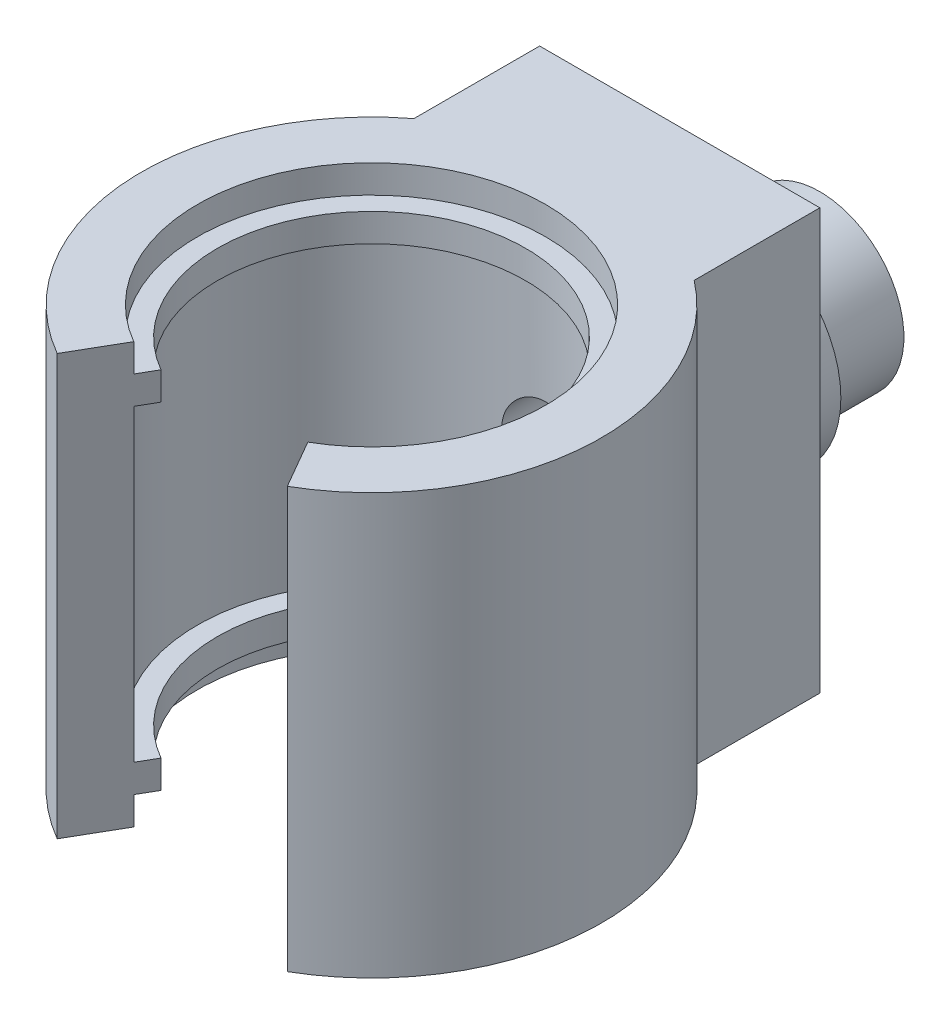
ISO-10303-21;
HEADER;
FILE_DESCRIPTION(('STEP AP214'),'2;1');
FILE_NAME('part.step','',(''),(''),'','','');
FILE_SCHEMA(('AUTOMOTIVE_DESIGN { 1 0 10303 214 1 1 1 1 }'));
ENDSEC;
DATA;
#1=APPLICATION_CONTEXT('core data for automotive mechanical design processes');
#2=APPLICATION_PROTOCOL_DEFINITION('international standard','automotive_design',2000,#1);
#3=PRODUCT_CONTEXT('',#1,'mechanical');
#4=PRODUCT('Part','Part','',(#3));
#5=PRODUCT_RELATED_PRODUCT_CATEGORY('part','',(#4));
#6=PRODUCT_DEFINITION_FORMATION('','',#4);
#7=PRODUCT_DEFINITION_CONTEXT('part definition',#1,'design');
#8=PRODUCT_DEFINITION('design','',#6,#7);
#9=PRODUCT_DEFINITION_SHAPE('','',#8);
#10=(LENGTH_UNIT() NAMED_UNIT(*) SI_UNIT(.MILLI.,.METRE.));
#11=(NAMED_UNIT(*) PLANE_ANGLE_UNIT() SI_UNIT($,.RADIAN.));
#12=(NAMED_UNIT(*) SI_UNIT($,.STERADIAN.) SOLID_ANGLE_UNIT());
#13=UNCERTAINTY_MEASURE_WITH_UNIT(LENGTH_MEASURE(1.E-05),#10,'distance_accuracy_value','');
#14=(GEOMETRIC_REPRESENTATION_CONTEXT(3) GLOBAL_UNCERTAINTY_ASSIGNED_CONTEXT((#13)) GLOBAL_UNIT_ASSIGNED_CONTEXT((#10,
#11,#12)) REPRESENTATION_CONTEXT('',''));
#15=CARTESIAN_POINT('',(0.,0.,0.));
#16=DIRECTION('',(0.,0.,1.));
#17=DIRECTION('',(1.,0.,0.));
#18=AXIS2_PLACEMENT_3D('',#15,#16,#17);
#19=CARTESIAN_POINT('',(0.,15.,0.));
#20=DIRECTION('',(0.,-1.,0.));
#21=DIRECTION('',(0.,0.,-1.));
#22=AXIS2_PLACEMENT_3D('',#19,#20,#21);
#23=CYLINDRICAL_SURFACE('',#22,6.21127915577534);
#24=DIRECTION('',(0.,1.,0.));
#25=VECTOR('',#24,1.);
#26=CARTESIAN_POINT('',(-3.10563957788768,0.,5.37912553889821));
#27=LINE('',#26,#25);
#28=CARTESIAN_POINT('',(-3.10563957788768,14.,5.37912553889821));
#29=VERTEX_POINT('',#28);
#30=CARTESIAN_POINT('',(-3.10563957788768,15.,5.37912553889821));
#31=VERTEX_POINT('',#30);
#32=EDGE_CURVE('E55',#29,#31,#27,.T.);
#33=ORIENTED_EDGE('',*,*,#32,.F.);
#34=CARTESIAN_POINT('',(0.,14.,0.));
#35=DIRECTION('',(0.,-1.,0.));
#36=DIRECTION('',(0.,0.,1.));
#37=AXIS2_PLACEMENT_3D('',#34,#35,#36);
#38=CIRCLE('',#37,6.21127915577534);
#39=CARTESIAN_POINT('',(3.10563957788768,14.,5.37912553889821));
#40=VERTEX_POINT('',#39);
#41=EDGE_CURVE('E183',#29,#40,#38,.T.);
#42=ORIENTED_EDGE('',*,*,#41,.T.);
#43=DIRECTION('',(0.,1.,0.));
#44=VECTOR('',#43,1.);
#45=CARTESIAN_POINT('',(3.10563957788768,0.,5.37912553889821));
#46=LINE('',#45,#44);
#47=CARTESIAN_POINT('',(3.10563957788768,15.,5.37912553889821));
#48=VERTEX_POINT('',#47);
#49=EDGE_CURVE('E226',#40,#48,#46,.T.);
#50=ORIENTED_EDGE('',*,*,#49,.T.);
#51=CARTESIAN_POINT('',(0.,15.,0.));
#52=DIRECTION('',(0.,1.,0.));
#53=DIRECTION('',(0.,0.,1.));
#54=AXIS2_PLACEMENT_3D('',#51,#52,#53);
#55=CIRCLE('',#54,6.21127915577534);
#56=EDGE_CURVE('E240',#48,#31,#55,.T.);
#57=ORIENTED_EDGE('',*,*,#56,.T.);
#58=EDGE_LOOP('',(#33,#42,#50,#57));
#59=FACE_BOUND('',#58,.T.);
#60=ADVANCED_FACE('F38',(#59),#23,.F.);
#61=CARTESIAN_POINT('',(3.10563957788768,0.,5.37912553889821));
#62=VERTEX_POINT('',#61);
#63=CARTESIAN_POINT('',(3.10563957788768,1.,5.37912553889821));
#64=VERTEX_POINT('',#63);
#65=EDGE_CURVE('E228',#62,#64,#46,.T.);
#66=ORIENTED_EDGE('',*,*,#65,.T.);
#67=CARTESIAN_POINT('',(0.,1.,0.));
#68=DIRECTION('',(0.,-1.,0.));
#69=DIRECTION('',(0.,0.,1.));
#70=AXIS2_PLACEMENT_3D('',#67,#68,#69);
#71=CIRCLE('',#70,6.21127915577534);
#72=CARTESIAN_POINT('',(-3.10563957788768,1.,5.37912553889821));
#73=VERTEX_POINT('',#72);
#74=EDGE_CURVE('E190',#73,#64,#71,.T.);
#75=ORIENTED_EDGE('',*,*,#74,.F.);
#76=CARTESIAN_POINT('',(-3.10563957788768,0.,5.37912553889821));
#77=VERTEX_POINT('',#76);
#78=EDGE_CURVE('E232',#77,#73,#27,.T.);
#79=ORIENTED_EDGE('',*,*,#78,.F.);
#80=CARTESIAN_POINT('',(0.,0.,0.));
#81=DIRECTION('',(0.,1.,0.));
#82=DIRECTION('',(0.,0.,1.));
#83=AXIS2_PLACEMENT_3D('',#80,#81,#82);
#84=CIRCLE('',#83,6.21127915577534);
#85=EDGE_CURVE('E237',#62,#77,#84,.T.);
#86=ORIENTED_EDGE('',*,*,#85,.F.);
#87=EDGE_LOOP('',(#66,#75,#79,#86));
#88=FACE_BOUND('',#87,.T.);
#89=ADVANCED_FACE('F326',(#88),#23,.F.);
#90=CARTESIAN_POINT('',(0.,15.,0.));
#91=DIRECTION('',(0.,-1.,0.));
#92=DIRECTION('',(0.,0.,-1.));
#93=AXIS2_PLACEMENT_3D('',#90,#91,#92);
#94=CYLINDRICAL_SURFACE('',#93,8.21127915577534);
#95=CARTESIAN_POINT('',(0.,15.,0.));
#96=DIRECTION('',(0.,1.,0.));
#97=DIRECTION('',(0.,0.,1.));
#98=AXIS2_PLACEMENT_3D('',#95,#96,#97);
#99=CIRCLE('',#98,8.21127915577534);
#100=CARTESIAN_POINT('',(4.10563957788768,15.,7.11117634646708));
#101=VERTEX_POINT('',#100);
#102=CARTESIAN_POINT('',(5.,15.,-6.51345571675057));
#103=VERTEX_POINT('',#102);
#104=EDGE_CURVE('E246',#101,#103,#99,.T.);
#105=ORIENTED_EDGE('',*,*,#104,.F.);
#106=DIRECTION('',(0.,1.,0.));
#107=VECTOR('',#106,1.);
#108=CARTESIAN_POINT('',(4.10563957788768,0.,7.11117634646708));
#109=LINE('',#108,#107);
#110=CARTESIAN_POINT('',(4.10563957788768,0.,7.11117634646708));
#111=VERTEX_POINT('',#110);
#112=EDGE_CURVE('E224',#111,#101,#109,.T.);
#113=ORIENTED_EDGE('',*,*,#112,.F.);
#114=CARTESIAN_POINT('',(0.,0.,0.));
#115=DIRECTION('',(0.,1.,0.));
#116=DIRECTION('',(0.,0.,1.));
#117=AXIS2_PLACEMENT_3D('',#114,#115,#116);
#118=CIRCLE('',#117,8.21127915577534);
#119=CARTESIAN_POINT('',(5.,0.,-6.51345571675057));
#120=VERTEX_POINT('',#119);
#121=EDGE_CURVE('E257',#111,#120,#118,.T.);
#122=ORIENTED_EDGE('',*,*,#121,.T.);
#123=DIRECTION('',(0.,-1.,0.));
#124=VECTOR('',#123,1.);
#125=CARTESIAN_POINT('',(5.,15.,-6.51345571675057));
#126=LINE('',#125,#124);
#127=EDGE_CURVE('E271',#103,#120,#126,.T.);
#128=ORIENTED_EDGE('',*,*,#127,.F.);
#129=EDGE_LOOP('',(#105,#113,#122,#128));
#130=FACE_BOUND('',#129,.T.);
#131=ADVANCED_FACE('F331',(#130),#94,.T.);
#132=CARTESIAN_POINT('',(0.,15.,0.));
#133=DIRECTION('',(0.,1.,0.));
#134=DIRECTION('',(0.,0.,1.));
#135=AXIS2_PLACEMENT_3D('',#132,#133,#134);
#136=PLANE('',#135);
#137=DIRECTION('',(-0.500000000000001,0.,-0.866025403784438));
#138=VECTOR('',#137,1.);
#139=CARTESIAN_POINT('',(3.10563957788768,15.,5.37912553889821));
#140=LINE('',#139,#138);
#141=EDGE_CURVE('E241',#101,#48,#140,.T.);
#142=ORIENTED_EDGE('',*,*,#141,.F.);
#143=ORIENTED_EDGE('',*,*,#104,.T.);
#144=DIRECTION('',(0.,0.,-1.));
#145=VECTOR('',#144,1.);
#146=CARTESIAN_POINT('',(5.,15.,-6.51345571675057));
#147=LINE('',#146,#145);
#148=CARTESIAN_POINT('',(5.,15.,-11.));
#149=VERTEX_POINT('',#148);
#150=EDGE_CURVE('E245',#103,#149,#147,.T.);
#151=ORIENTED_EDGE('',*,*,#150,.T.);
#152=DIRECTION('',(-1.,0.,0.));
#153=VECTOR('',#152,1.);
#154=CARTESIAN_POINT('',(-5.,15.,-11.));
#155=LINE('',#154,#153);
#156=CARTESIAN_POINT('',(-5.,15.,-11.));
#157=VERTEX_POINT('',#156);
#158=EDGE_CURVE('E248',#149,#157,#155,.T.);
#159=ORIENTED_EDGE('',*,*,#158,.T.);
#160=DIRECTION('',(0.,0.,1.));
#161=VECTOR('',#160,1.);
#162=CARTESIAN_POINT('',(-5.,15.,-6.51345571675057));
#163=LINE('',#162,#161);
#164=CARTESIAN_POINT('',(-5.,15.,-6.51345571675057));
#165=VERTEX_POINT('',#164);
#166=EDGE_CURVE('E250',#157,#165,#163,.T.);
#167=ORIENTED_EDGE('',*,*,#166,.T.);
#168=CARTESIAN_POINT('',(-4.10563957788768,15.,7.11117634646708));
#169=VERTEX_POINT('',#168);
#170=EDGE_CURVE('E242',#165,#169,#99,.T.);
#171=ORIENTED_EDGE('',*,*,#170,.T.);
#172=DIRECTION('',(-0.500000000000001,0.,0.866025403784438));
#173=VECTOR('',#172,1.);
#174=CARTESIAN_POINT('',(-3.10563957788768,15.,5.37912553889821));
#175=LINE('',#174,#173);
#176=EDGE_CURVE('E230',#31,#169,#175,.T.);
#177=ORIENTED_EDGE('',*,*,#176,.F.);
#178=ORIENTED_EDGE('',*,*,#56,.F.);
#179=EDGE_LOOP('',(#142,#143,#151,#159,#167,#171,#177,#178));
#180=FACE_BOUND('',#179,.T.);
#181=ADVANCED_FACE('F336',(#180),#136,.T.);
#182=CARTESIAN_POINT('',(0.,0.,0.));
#183=DIRECTION('',(0.,1.,0.));
#184=DIRECTION('',(0.,0.,1.));
#185=AXIS2_PLACEMENT_3D('',#182,#183,#184);
#186=PLANE('',#185);
#187=ORIENTED_EDGE('',*,*,#121,.F.);
#188=DIRECTION('',(-0.500000000000001,0.,-0.866025403784438));
#189=VECTOR('',#188,1.);
#190=CARTESIAN_POINT('',(3.10563957788768,0.,5.37912553889821));
#191=LINE('',#190,#189);
#192=EDGE_CURVE('E221',#111,#62,#191,.T.);
#193=ORIENTED_EDGE('',*,*,#192,.T.);
#194=ORIENTED_EDGE('',*,*,#85,.T.);
#195=DIRECTION('',(-0.500000000000001,0.,0.866025403784438));
#196=VECTOR('',#195,1.);
#197=CARTESIAN_POINT('',(-3.10563957788768,0.,5.37912553889821));
#198=LINE('',#197,#196);
#199=CARTESIAN_POINT('',(-4.10563957788768,0.,7.11117634646708));
#200=VERTEX_POINT('',#199);
#201=EDGE_CURVE('E217',#77,#200,#198,.T.);
#202=ORIENTED_EDGE('',*,*,#201,.T.);
#203=CARTESIAN_POINT('',(-5.,0.,-6.51345571675057));
#204=VERTEX_POINT('',#203);
#205=EDGE_CURVE('E253',#204,#200,#118,.T.);
#206=ORIENTED_EDGE('',*,*,#205,.F.);
#207=DIRECTION('',(0.,0.,1.));
#208=VECTOR('',#207,1.);
#209=CARTESIAN_POINT('',(-5.,0.,-6.51345571675057));
#210=LINE('',#209,#208);
#211=CARTESIAN_POINT('',(-5.,0.,-11.));
#212=VERTEX_POINT('',#211);
#213=EDGE_CURVE('E261',#212,#204,#210,.T.);
#214=ORIENTED_EDGE('',*,*,#213,.F.);
#215=DIRECTION('',(-1.,0.,0.));
#216=VECTOR('',#215,1.);
#217=CARTESIAN_POINT('',(-5.,0.,-11.));
#218=LINE('',#217,#216);
#219=CARTESIAN_POINT('',(5.,0.,-11.));
#220=VERTEX_POINT('',#219);
#221=EDGE_CURVE('E259',#220,#212,#218,.T.);
#222=ORIENTED_EDGE('',*,*,#221,.F.);
#223=DIRECTION('',(0.,0.,-1.));
#224=VECTOR('',#223,1.);
#225=CARTESIAN_POINT('',(5.,0.,-6.51345571675057));
#226=LINE('',#225,#224);
#227=EDGE_CURVE('E256',#120,#220,#226,.T.);
#228=ORIENTED_EDGE('',*,*,#227,.F.);
#229=EDGE_LOOP('',(#187,#193,#194,#202,#206,#214,#222,#228));
#230=FACE_BOUND('',#229,.T.);
#231=ADVANCED_FACE('F345',(#230),#186,.F.);
#232=ORIENTED_EDGE('',*,*,#205,.T.);
#233=DIRECTION('',(0.,1.,0.));
#234=VECTOR('',#233,1.);
#235=CARTESIAN_POINT('',(-4.10563957788768,0.,7.11117634646708));
#236=LINE('',#235,#234);
#237=EDGE_CURVE('E227',#200,#169,#236,.T.);
#238=ORIENTED_EDGE('',*,*,#237,.T.);
#239=ORIENTED_EDGE('',*,*,#170,.F.);
#240=DIRECTION('',(0.,-1.,0.));
#241=VECTOR('',#240,1.);
#242=CARTESIAN_POINT('',(-5.,15.,-6.51345571675057));
#243=LINE('',#242,#241);
#244=EDGE_CURVE('E252',#165,#204,#243,.T.);
#245=ORIENTED_EDGE('',*,*,#244,.T.);
#246=EDGE_LOOP('',(#232,#238,#239,#245));
#247=FACE_BOUND('',#246,.T.);
#248=ADVANCED_FACE('F40',(#247),#94,.T.);
#249=CARTESIAN_POINT('',(5.,15.,-6.51345571675057));
#250=DIRECTION('',(-1.,0.,0.));
#251=DIRECTION('',(0.,0.,1.));
#252=AXIS2_PLACEMENT_3D('',#249,#250,#251);
#253=PLANE('',#252);
#254=ORIENTED_EDGE('',*,*,#227,.T.);
#255=DIRECTION('',(0.,-1.,0.));
#256=VECTOR('',#255,1.);
#257=CARTESIAN_POINT('',(5.,15.,-11.));
#258=LINE('',#257,#256);
#259=EDGE_CURVE('E268',#149,#220,#258,.T.);
#260=ORIENTED_EDGE('',*,*,#259,.F.);
#261=ORIENTED_EDGE('',*,*,#150,.F.);
#262=ORIENTED_EDGE('',*,*,#127,.T.);
#263=EDGE_LOOP('',(#254,#260,#261,#262));
#264=FACE_BOUND('',#263,.T.);
#265=ADVANCED_FACE('F357',(#264),#253,.F.);
#266=CARTESIAN_POINT('',(-5.,15.,-11.));
#267=DIRECTION('',(0.,0.,1.));
#268=DIRECTION('',(1.,0.,0.));
#269=AXIS2_PLACEMENT_3D('',#266,#267,#268);
#270=PLANE('',#269);
#271=CARTESIAN_POINT('',(0.,7.5,-11.));
#272=DIRECTION('',(0.,0.,-1.));
#273=DIRECTION('',(-1.,0.,0.));
#274=AXIS2_PLACEMENT_3D('',#271,#272,#273);
#275=CIRCLE('',#274,3.75);
#276=CARTESIAN_POINT('',(-3.75,7.5,-11.));
#277=VERTEX_POINT('',#276);
#278=EDGE_CURVE('E47',#277,#277,#275,.T.);
#279=ORIENTED_EDGE('',*,*,#278,.F.);
#280=EDGE_LOOP('',(#279));
#281=FACE_BOUND('',#280,.T.);
#282=ORIENTED_EDGE('',*,*,#221,.T.);
#283=DIRECTION('',(0.,-1.,0.));
#284=VECTOR('',#283,1.);
#285=CARTESIAN_POINT('',(-5.,15.,-11.));
#286=LINE('',#285,#284);
#287=EDGE_CURVE('E265',#157,#212,#286,.T.);
#288=ORIENTED_EDGE('',*,*,#287,.F.);
#289=ORIENTED_EDGE('',*,*,#158,.F.);
#290=ORIENTED_EDGE('',*,*,#259,.T.);
#291=EDGE_LOOP('',(#282,#288,#289,#290));
#292=FACE_BOUND('',#291,.T.);
#293=ADVANCED_FACE('F362',(#281,#292),#270,.F.);
#294=CARTESIAN_POINT('',(-5.,15.,-6.51345571675057));
#295=DIRECTION('',(1.,0.,0.));
#296=DIRECTION('',(0.,0.,-1.));
#297=AXIS2_PLACEMENT_3D('',#294,#295,#296);
#298=PLANE('',#297);
#299=ORIENTED_EDGE('',*,*,#213,.T.);
#300=ORIENTED_EDGE('',*,*,#244,.F.);
#301=ORIENTED_EDGE('',*,*,#166,.F.);
#302=ORIENTED_EDGE('',*,*,#287,.T.);
#303=EDGE_LOOP('',(#299,#300,#301,#302));
#304=FACE_BOUND('',#303,.T.);
#305=ADVANCED_FACE('F324',(#304),#298,.F.);
#306=CARTESIAN_POINT('',(-1.4,7.5,-6.05144517871304));
#307=CARTESIAN_POINT('',(-1.39999741655848,7.42244074967617,-6.05144674295134));
#308=CARTESIAN_POINT('',(-1.39353295951935,7.34485097724104,-6.05295250314705));
#309=CARTESIAN_POINT('',(-1.36787681919197,7.19188231366613,-6.05880092190033));
#310=CARTESIAN_POINT('',(-1.34867630172473,7.11650499508616,-6.06314554956488));
#311=CARTESIAN_POINT('',(-1.29818694064797,6.97019604780264,-6.07415522084465));
#312=CARTESIAN_POINT('',(-1.26691183156465,6.89925947402908,-6.08081762719978));
#313=CARTESIAN_POINT('',(-1.19320094136914,6.76363725979286,-6.09570897726698));
#314=CARTESIAN_POINT('',(-1.15076524470228,6.69895157203864,-6.10393790912599));
#315=CARTESIAN_POINT('',(-1.05512656023878,6.5765070767414,-6.12119999393773));
#316=CARTESIAN_POINT('',(-1.00176108461976,6.51887668777774,-6.13024396952495));
#317=CARTESIAN_POINT('',(-0.886128315498982,6.41330474836805,-6.14802254565793));
#318=CARTESIAN_POINT('',(-0.823860303799267,6.36536398037069,-6.15675712117233));
#319=CARTESIAN_POINT('',(-0.691325167243824,6.28002061007935,-6.17305100334222));
#320=CARTESIAN_POINT('',(-0.620976254492197,6.24274206427739,-6.18059604950956));
#321=CARTESIAN_POINT('',(-0.474813545368164,6.18058474825768,-6.19353825239675));
#322=CARTESIAN_POINT('',(-0.399000402165996,6.15570449880625,-6.19893566533401));
#323=CARTESIAN_POINT('',(-0.24539733545118,6.11945545030858,-6.20689797414003));
#324=CARTESIAN_POINT('',(-0.167661141671802,6.10786914913317,-6.20950841671539));
#325=CARTESIAN_POINT('',(-0.0113074882683587,6.09785630639812,-6.21176065025935));
#326=CARTESIAN_POINT('',(0.0673098634049297,6.09942817005378,-6.21140280098838));
#327=CARTESIAN_POINT('',(0.221692943819922,6.11552617091206,-6.20779339705777));
#328=CARTESIAN_POINT('',(0.297484530786542,6.12981780444421,-6.2045942276571));
#329=CARTESIAN_POINT('',(0.445565052039461,6.17057531351617,-6.19572158777144));
#330=CARTESIAN_POINT('',(0.51785382149793,6.19704176133772,-6.19004800097617));
#331=CARTESIAN_POINT('',(0.657520921735607,6.26160140202038,-6.17678059744856));
#332=CARTESIAN_POINT('',(0.724857252400683,6.29978237228744,-6.16917236063072));
#333=CARTESIAN_POINT('',(0.852251907256294,6.38662157415156,-6.15286812402321));
#334=CARTESIAN_POINT('',(0.912309181058971,6.43528131505746,-6.14417196761083));
#335=CARTESIAN_POINT('',(1.0248365664793,6.54296963823549,-6.1264198333266));
#336=CARTESIAN_POINT('',(1.0771098932032,6.60220342623982,-6.11736015015751));
#337=CARTESIAN_POINT('',(1.17101938096968,6.72869059551659,-6.10008106203917));
#338=CARTESIAN_POINT('',(1.2126552163571,6.7959442222152,-6.09186168281952));
#339=CARTESIAN_POINT('',(1.28420289337599,6.93689373646631,-6.07718325265418));
#340=CARTESIAN_POINT('',(1.31407550513569,7.01061019471472,-6.07073011349999));
#341=CARTESIAN_POINT('',(1.36094829955712,7.16219717647347,-6.06039525321015));
#342=CARTESIAN_POINT('',(1.37795066487194,7.24006699322075,-6.05651309607804));
#343=CARTESIAN_POINT('',(1.39829083685189,7.39594667625268,-6.0518492264115));
#344=CARTESIAN_POINT('',(1.40191607268794,7.47391713031893,-6.0510023085079));
#345=CARTESIAN_POINT('',(1.39617903701098,7.62934833922898,-6.05232858775846));
#346=CARTESIAN_POINT('',(1.3868177176649,7.70680913102257,-6.05450156349573));
#347=CARTESIAN_POINT('',(1.3556232495431,7.8580080740866,-6.0615610275097));
#348=CARTESIAN_POINT('',(1.33395022198825,7.93178103947383,-6.06641265596834));
#349=CARTESIAN_POINT('',(1.27892176011211,8.07464829508665,-6.07825098760357));
#350=CARTESIAN_POINT('',(1.24556515127348,8.14374211409726,-6.08523790542574));
#351=CARTESIAN_POINT('',(1.16748962187505,8.27652835767623,-6.10070161053213));
#352=CARTESIAN_POINT('',(1.12259469518377,8.34011463293559,-6.10920078493257));
#353=CARTESIAN_POINT('',(1.02294563750656,8.45895642769333,-6.12667317996916));
#354=CARTESIAN_POINT('',(0.968190202470265,8.51421084352688,-6.13564646319508));
#355=CARTESIAN_POINT('',(0.849069961693782,8.61594591756109,-6.15327218844914));
#356=CARTESIAN_POINT('',(0.784535560653021,8.66223001910955,-6.16191468743425));
#357=CARTESIAN_POINT('',(0.648441162250651,8.74330063164673,-6.17771791316331));
#358=CARTESIAN_POINT('',(0.576881503468196,8.77808769637753,-6.18487871126554));
#359=CARTESIAN_POINT('',(0.429226909254133,8.83490793197618,-6.19687000117714));
#360=CARTESIAN_POINT('',(0.35316540294957,8.85702461297993,-6.20171571560813));
#361=CARTESIAN_POINT('',(0.198284321042645,8.88813534639949,-6.20859685935039));
#362=CARTESIAN_POINT('',(0.119465174561126,8.89713143131404,-6.21063272393013));
#363=CARTESIAN_POINT('',(-0.036831969037835,8.90164950686265,-6.21165087001155));
#364=CARTESIAN_POINT('',(-0.114301214969824,8.89746423631772,-6.21069949520856));
#365=CARTESIAN_POINT('',(-0.26740189189339,8.87639638350823,-6.20599321026953));
#366=CARTESIAN_POINT('',(-0.343033359950535,8.85951405754639,-6.20223835672451));
#367=CARTESIAN_POINT('',(-0.490068775119286,8.81367521764367,-6.19235303912508));
#368=CARTESIAN_POINT('',(-0.561487016706953,8.78476257369692,-6.18623121220489));
#369=CARTESIAN_POINT('',(-0.69849642287564,8.71572572507948,-6.17226370985493));
#370=CARTESIAN_POINT('',(-0.764086983872279,8.67560036086508,-6.1644178561559));
#371=CARTESIAN_POINT('',(-0.888999316281081,8.58433504398396,-6.14766005327489));
#372=CARTESIAN_POINT('',(-0.948169282049802,8.53299064485752,-6.138729904151));
#373=CARTESIAN_POINT('',(-1.05715325602981,8.42115405773719,-6.12090453272239));
#374=CARTESIAN_POINT('',(-1.10696498621931,8.36065964886102,-6.11200931943652));
#375=CARTESIAN_POINT('',(-1.1965123896917,8.23119249727105,-6.09511759780477));
#376=CARTESIAN_POINT('',(-1.23609268893071,8.16211024001219,-6.08713587029127));
#377=CARTESIAN_POINT('',(-1.30301854810748,8.01810759586773,-6.07316302221681));
#378=CARTESIAN_POINT('',(-1.33037417574262,7.94319207293595,-6.06717026467897));
#379=CARTESIAN_POINT('',(-1.36735187726523,7.80686567289764,-6.05892782834633));
#380=CARTESIAN_POINT('',(-1.37957082234304,7.74617833288489,-6.0561409430718));
#381=CARTESIAN_POINT('',(-1.39589569054642,7.62366708871455,-6.05239904500231));
#382=CARTESIAN_POINT('',(-1.40000205995303,7.5618432472659,-6.05144393143982));
#383=CARTESIAN_POINT('',(-1.4,7.5,-6.05144517871304));
#384=B_SPLINE_CURVE_WITH_KNOTS('',3,(#306,#307,#308,#309,#310,#311,#312,#313,#314,#315,#316,
#317,#318,#319,#320,#321,#322,#323,#324,#325,#326,#327,#328,#329,#330,#331,#332,#333,#334,#335,
#336,#337,#338,#339,#340,#341,#342,#343,#344,#345,#346,#347,#348,#349,#350,#351,#352,#353,#354,
#355,#356,#357,#358,#359,#360,#361,#362,#363,#364,#365,#366,#367,#368,#369,#370,#371,#372,#373,
#374,#375,#376,#377,#378,#379,#380,#381,#382,#383),.UNSPECIFIED.,.T.,.F.,(4,2,2,2,2,2,2,2,2,2,2,
2,2,2,2,2,2,2,2,2,2,2,2,2,2,2,2,2,2,2,2,2,2,2,2,2,2,2,4),(0.,0.232451012871686,
0.465063430774375,0.697412034111021,0.929758879458818,1.1658498258538,1.40195982926941,
1.64071457675884,1.87944083173079,2.11420295015271,2.34893661554805,2.57943032693494,
2.80993487387284,3.04221062141009,3.27451984716843,3.5119580260655,3.749403473002,
3.98763421702687,4.22582455066486,4.45886615374066,4.69189067124006,4.92195176032677,
5.15203598344373,5.38586303308209,5.61972102904384,5.85823445235322,6.09673638625269,
6.33364771986117,6.57052234986657,6.80217373196504,7.03382043807473,7.26462971888123,
7.49546287726161,7.73091772426696,7.96642981264639,8.2053322492783,8.4440375722244,
8.62939671744603,8.81474566558842),.UNSPECIFIED.);
#385=CARTESIAN_POINT('',(-1.4,7.5,-6.05144517871304));
#386=VERTEX_POINT('',#385);
#387=EDGE_CURVE('E186',#386,#386,#384,.T.);
#388=ORIENTED_EDGE('',*,*,#387,.F.);
#389=EDGE_LOOP('',(#388));
#390=FACE_BOUND('',#389,.T.);
#391=CARTESIAN_POINT('',(0.,13.,0.));
#392=DIRECTION('',(0.,-1.,0.));
#393=DIRECTION('',(0.,0.,1.));
#394=AXIS2_PLACEMENT_3D('',#391,#392,#393);
#395=CIRCLE('',#394,6.21127915577534);
#396=CARTESIAN_POINT('',(-3.10563957788768,13.,5.37912553889821));
#397=VERTEX_POINT('',#396);
#398=CARTESIAN_POINT('',(3.10563957788768,13.,5.37912553889821));
#399=VERTEX_POINT('',#398);
#400=EDGE_CURVE('E63',#397,#399,#395,.T.);
#401=ORIENTED_EDGE('',*,*,#400,.F.);
#402=CARTESIAN_POINT('',(-3.10563957788768,2.,5.37912553889821));
#403=VERTEX_POINT('',#402);
#404=EDGE_CURVE('E176',#403,#397,#27,.T.);
#405=ORIENTED_EDGE('',*,*,#404,.F.);
#406=CARTESIAN_POINT('',(0.,2.,0.));
#407=DIRECTION('',(0.,-1.,0.));
#408=DIRECTION('',(0.,0.,1.));
#409=AXIS2_PLACEMENT_3D('',#406,#407,#408);
#410=CIRCLE('',#409,6.21127915577534);
#411=CARTESIAN_POINT('',(3.10563957788768,2.,5.37912553889821));
#412=VERTEX_POINT('',#411);
#413=EDGE_CURVE('E192',#403,#412,#410,.T.);
#414=ORIENTED_EDGE('',*,*,#413,.T.);
#415=EDGE_CURVE('E231',#412,#399,#46,.T.);
#416=ORIENTED_EDGE('',*,*,#415,.T.);
#417=EDGE_LOOP('',(#401,#405,#414,#416));
#418=FACE_BOUND('',#417,.T.);
#419=ADVANCED_FACE('F284',(#390,#418),#23,.F.);
#420=CARTESIAN_POINT('',(-3.10563957788768,0.,5.37912553889821));
#421=DIRECTION('',(-0.866025403784438,0.,-0.500000000000001));
#422=DIRECTION('',(-0.500000000000001,0.,0.866025403784438));
#423=AXIS2_PLACEMENT_3D('',#420,#421,#422);
#424=PLANE('',#423);
#425=ORIENTED_EDGE('',*,*,#176,.T.);
#426=ORIENTED_EDGE('',*,*,#237,.F.);
#427=ORIENTED_EDGE('',*,*,#201,.F.);
#428=ORIENTED_EDGE('',*,*,#78,.T.);
#429=DIRECTION('',(-0.500000000000003,0.,0.866025403784437));
#430=VECTOR('',#429,1.);
#431=CARTESIAN_POINT('',(-3.10563957788768,1.,5.37912553889821));
#432=LINE('',#431,#430);
#433=CARTESIAN_POINT('',(-2.74999999245474,1.,4.76313970774563));
#434=VERTEX_POINT('',#433);
#435=EDGE_CURVE('E196',#434,#73,#432,.T.);
#436=ORIENTED_EDGE('',*,*,#435,.F.);
#437=DIRECTION('',(0.,-1.,0.));
#438=VECTOR('',#437,1.);
#439=CARTESIAN_POINT('',(-2.74999999245474,2.,4.76313970774563));
#440=LINE('',#439,#438);
#441=CARTESIAN_POINT('',(-2.74999999245474,2.,4.76313970774563));
#442=VERTEX_POINT('',#441);
#443=EDGE_CURVE('E215',#442,#434,#440,.T.);
#444=ORIENTED_EDGE('',*,*,#443,.F.);
#445=DIRECTION('',(-0.500000000000003,0.,0.866025403784437));
#446=VECTOR('',#445,1.);
#447=CARTESIAN_POINT('',(-3.10563957788768,2.,5.37912553889821));
#448=LINE('',#447,#446);
#449=EDGE_CURVE('E202',#442,#403,#448,.T.);
#450=ORIENTED_EDGE('',*,*,#449,.T.);
#451=ORIENTED_EDGE('',*,*,#404,.T.);
#452=DIRECTION('',(-0.500000000000003,0.,0.866025403784437));
#453=VECTOR('',#452,1.);
#454=CARTESIAN_POINT('',(-3.10563957788768,13.,5.37912553889821));
#455=LINE('',#454,#453);
#456=CARTESIAN_POINT('',(-2.74999999245474,13.,4.76313970774563));
#457=VERTEX_POINT('',#456);
#458=EDGE_CURVE('E158',#457,#397,#455,.T.);
#459=ORIENTED_EDGE('',*,*,#458,.F.);
#460=DIRECTION('',(0.,1.,0.));
#461=VECTOR('',#460,1.);
#462=CARTESIAN_POINT('',(-2.74999999245474,13.,4.76313970774563));
#463=LINE('',#462,#461);
#464=CARTESIAN_POINT('',(-2.74999999245474,14.,4.76313970774563));
#465=VERTEX_POINT('',#464);
#466=EDGE_CURVE('E166',#457,#465,#463,.T.);
#467=ORIENTED_EDGE('',*,*,#466,.T.);
#468=DIRECTION('',(-0.500000000000003,0.,0.866025403784437));
#469=VECTOR('',#468,1.);
#470=CARTESIAN_POINT('',(-3.10563957788768,14.,5.37912553889821));
#471=LINE('',#470,#469);
#472=EDGE_CURVE('E185',#465,#29,#471,.T.);
#473=ORIENTED_EDGE('',*,*,#472,.T.);
#474=ORIENTED_EDGE('',*,*,#32,.T.);
#475=EDGE_LOOP('',(#425,#426,#427,#428,#436,#444,#450,#451,#459,#467,#473,#474));
#476=FACE_BOUND('',#475,.T.);
#477=ADVANCED_FACE('F174',(#476),#424,.F.);
#478=CARTESIAN_POINT('',(3.10563957788768,0.,5.37912553889821));
#479=DIRECTION('',(0.866025403784438,0.,-0.500000000000001));
#480=DIRECTION('',(-0.500000000000001,0.,-0.866025403784438));
#481=AXIS2_PLACEMENT_3D('',#478,#479,#480);
#482=PLANE('',#481);
#483=ORIENTED_EDGE('',*,*,#141,.T.);
#484=ORIENTED_EDGE('',*,*,#49,.F.);
#485=DIRECTION('',(-0.499999999999996,0.,-0.866025403784441));
#486=VECTOR('',#485,1.);
#487=CARTESIAN_POINT('',(2.74999999245475,14.,4.76313970774563));
#488=LINE('',#487,#486);
#489=CARTESIAN_POINT('',(2.74999999245474,14.,4.76313970774563));
#490=VERTEX_POINT('',#489);
#491=EDGE_CURVE('E178',#40,#490,#488,.T.);
#492=ORIENTED_EDGE('',*,*,#491,.T.);
#493=DIRECTION('',(0.,1.,0.));
#494=VECTOR('',#493,1.);
#495=CARTESIAN_POINT('',(2.74999999245474,13.,4.76313970774563));
#496=LINE('',#495,#494);
#497=CARTESIAN_POINT('',(2.74999999245474,13.,4.76313970774563));
#498=VERTEX_POINT('',#497);
#499=EDGE_CURVE('E172',#498,#490,#496,.T.);
#500=ORIENTED_EDGE('',*,*,#499,.F.);
#501=DIRECTION('',(-0.499999999999996,0.,-0.866025403784441));
#502=VECTOR('',#501,1.);
#503=CARTESIAN_POINT('',(2.74999999245475,13.,4.76313970774563));
#504=LINE('',#503,#502);
#505=EDGE_CURVE('E160',#399,#498,#504,.T.);
#506=ORIENTED_EDGE('',*,*,#505,.F.);
#507=ORIENTED_EDGE('',*,*,#415,.F.);
#508=DIRECTION('',(-0.499999999999996,0.,-0.866025403784441));
#509=VECTOR('',#508,1.);
#510=CARTESIAN_POINT('',(2.74999999245475,2.,4.76313970774563));
#511=LINE('',#510,#509);
#512=CARTESIAN_POINT('',(2.74999999245474,2.,4.76313970774563));
#513=VERTEX_POINT('',#512);
#514=EDGE_CURVE('E195',#412,#513,#511,.T.);
#515=ORIENTED_EDGE('',*,*,#514,.T.);
#516=DIRECTION('',(0.,-1.,0.));
#517=VECTOR('',#516,1.);
#518=CARTESIAN_POINT('',(2.74999999245474,2.,4.76313970774563));
#519=LINE('',#518,#517);
#520=CARTESIAN_POINT('',(2.74999999245474,1.,4.76313970774563));
#521=VERTEX_POINT('',#520);
#522=EDGE_CURVE('E204',#513,#521,#519,.T.);
#523=ORIENTED_EDGE('',*,*,#522,.T.);
#524=DIRECTION('',(-0.499999999999996,0.,-0.866025403784441));
#525=VECTOR('',#524,1.);
#526=CARTESIAN_POINT('',(2.74999999245475,1.,4.76313970774563));
#527=LINE('',#526,#525);
#528=EDGE_CURVE('E207',#64,#521,#527,.T.);
#529=ORIENTED_EDGE('',*,*,#528,.F.);
#530=ORIENTED_EDGE('',*,*,#65,.F.);
#531=ORIENTED_EDGE('',*,*,#192,.F.);
#532=ORIENTED_EDGE('',*,*,#112,.T.);
#533=EDGE_LOOP('',(#483,#484,#492,#500,#506,#507,#515,#523,#529,#530,#531,#532));
#534=FACE_BOUND('',#533,.T.);
#535=ADVANCED_FACE('F316',(#534),#482,.F.);
#536=CARTESIAN_POINT('',(0.,2.,0.));
#537=DIRECTION('',(0.,-1.,0.));
#538=DIRECTION('',(0.,0.,-1.));
#539=AXIS2_PLACEMENT_3D('',#536,#537,#538);
#540=CYLINDRICAL_SURFACE('',#539,5.49999998490947);
#541=CARTESIAN_POINT('',(0.,1.,0.));
#542=DIRECTION('',(0.,1.,0.));
#543=DIRECTION('',(0.,0.,-1.));
#544=AXIS2_PLACEMENT_3D('',#541,#542,#543);
#545=CIRCLE('',#544,5.49999998490947);
#546=EDGE_CURVE('E210',#521,#434,#545,.T.);
#547=ORIENTED_EDGE('',*,*,#546,.F.);
#548=ORIENTED_EDGE('',*,*,#522,.F.);
#549=CARTESIAN_POINT('',(0.,2.,0.));
#550=DIRECTION('',(0.,1.,0.));
#551=DIRECTION('',(0.,0.,-1.));
#552=AXIS2_PLACEMENT_3D('',#549,#550,#551);
#553=CIRCLE('',#552,5.49999998490947);
#554=EDGE_CURVE('E199',#513,#442,#553,.T.);
#555=ORIENTED_EDGE('',*,*,#554,.T.);
#556=ORIENTED_EDGE('',*,*,#443,.T.);
#557=EDGE_LOOP('',(#547,#548,#555,#556));
#558=FACE_BOUND('',#557,.T.);
#559=ADVANCED_FACE('F309',(#558),#540,.F.);
#560=CARTESIAN_POINT('',(0.,2.,0.));
#561=DIRECTION('',(0.,1.,0.));
#562=DIRECTION('',(0.,0.,1.));
#563=AXIS2_PLACEMENT_3D('',#560,#561,#562);
#564=PLANE('',#563);
#565=ORIENTED_EDGE('',*,*,#413,.F.);
#566=ORIENTED_EDGE('',*,*,#449,.F.);
#567=ORIENTED_EDGE('',*,*,#554,.F.);
#568=ORIENTED_EDGE('',*,*,#514,.F.);
#569=EDGE_LOOP('',(#565,#566,#567,#568));
#570=FACE_BOUND('',#569,.T.);
#571=ADVANCED_FACE('F306',(#570),#564,.T.);
#572=CARTESIAN_POINT('',(0.,1.,0.));
#573=DIRECTION('',(0.,1.,0.));
#574=DIRECTION('',(0.,0.,1.));
#575=AXIS2_PLACEMENT_3D('',#572,#573,#574);
#576=PLANE('',#575);
#577=ORIENTED_EDGE('',*,*,#74,.T.);
#578=ORIENTED_EDGE('',*,*,#528,.T.);
#579=ORIENTED_EDGE('',*,*,#546,.T.);
#580=ORIENTED_EDGE('',*,*,#435,.T.);
#581=EDGE_LOOP('',(#577,#578,#579,#580));
#582=FACE_BOUND('',#581,.T.);
#583=ADVANCED_FACE('F305',(#582),#576,.F.);
#584=CARTESIAN_POINT('',(0.,13.,0.));
#585=DIRECTION('',(0.,1.,0.));
#586=DIRECTION('',(0.,0.,1.));
#587=AXIS2_PLACEMENT_3D('',#584,#585,#586);
#588=CYLINDRICAL_SURFACE('',#587,5.49999998490947);
#589=CARTESIAN_POINT('',(0.,14.,0.));
#590=DIRECTION('',(0.,1.,0.));
#591=DIRECTION('',(0.,0.,-1.));
#592=AXIS2_PLACEMENT_3D('',#589,#590,#591);
#593=CIRCLE('',#592,5.49999998490947);
#594=EDGE_CURVE('E169',#490,#465,#593,.T.);
#595=ORIENTED_EDGE('',*,*,#594,.T.);
#596=ORIENTED_EDGE('',*,*,#466,.F.);
#597=CARTESIAN_POINT('',(0.,13.,0.));
#598=DIRECTION('',(0.,1.,0.));
#599=DIRECTION('',(0.,0.,-1.));
#600=AXIS2_PLACEMENT_3D('',#597,#598,#599);
#601=CIRCLE('',#600,5.49999998490947);
#602=EDGE_CURVE('E154',#498,#457,#601,.T.);
#603=ORIENTED_EDGE('',*,*,#602,.F.);
#604=ORIENTED_EDGE('',*,*,#499,.T.);
#605=EDGE_LOOP('',(#595,#596,#603,#604));
#606=FACE_BOUND('',#605,.T.);
#607=ADVANCED_FACE('F167',(#606),#588,.F.);
#608=CARTESIAN_POINT('',(0.,13.,0.));
#609=DIRECTION('',(0.,-1.,0.));
#610=DIRECTION('',(0.,0.,1.));
#611=AXIS2_PLACEMENT_3D('',#608,#609,#610);
#612=PLANE('',#611);
#613=ORIENTED_EDGE('',*,*,#400,.T.);
#614=ORIENTED_EDGE('',*,*,#505,.T.);
#615=ORIENTED_EDGE('',*,*,#602,.T.);
#616=ORIENTED_EDGE('',*,*,#458,.T.);
#617=EDGE_LOOP('',(#613,#614,#615,#616));
#618=FACE_BOUND('',#617,.T.);
#619=ADVANCED_FACE('F156',(#618),#612,.T.);
#620=CARTESIAN_POINT('',(0.,14.,0.));
#621=DIRECTION('',(0.,-1.,0.));
#622=DIRECTION('',(0.,0.,1.));
#623=AXIS2_PLACEMENT_3D('',#620,#621,#622);
#624=PLANE('',#623);
#625=ORIENTED_EDGE('',*,*,#41,.F.);
#626=ORIENTED_EDGE('',*,*,#472,.F.);
#627=ORIENTED_EDGE('',*,*,#594,.F.);
#628=ORIENTED_EDGE('',*,*,#491,.F.);
#629=EDGE_LOOP('',(#625,#626,#627,#628));
#630=FACE_BOUND('',#629,.T.);
#631=ADVANCED_FACE('F294',(#630),#624,.F.);
#632=CARTESIAN_POINT('',(0.,7.5,-0.999999999999999));
#633=DIRECTION('',(0.,0.,-1.));
#634=DIRECTION('',(-1.,0.,0.));
#635=AXIS2_PLACEMENT_3D('',#632,#633,#634);
#636=CYLINDRICAL_SURFACE('',#635,1.4);
#637=ORIENTED_EDGE('',*,*,#387,.T.);
#638=EDGE_LOOP('',(#637));
#639=FACE_BOUND('',#638,.T.);
#640=CARTESIAN_POINT('',(0.,7.5,-16.));
#641=DIRECTION('',(0.,0.,-1.));
#642=DIRECTION('',(-1.,0.,0.));
#643=AXIS2_PLACEMENT_3D('',#640,#641,#642);
#644=CIRCLE('',#643,1.4);
#645=CARTESIAN_POINT('',(-1.4,7.5,-16.));
#646=VERTEX_POINT('',#645);
#647=EDGE_CURVE('E42',#646,#646,#644,.T.);
#648=ORIENTED_EDGE('',*,*,#647,.T.);
#649=EDGE_LOOP('',(#648));
#650=FACE_BOUND('',#649,.T.);
#651=ADVANCED_FACE('F288',(#639,#650),#636,.F.);
#652=CARTESIAN_POINT('',(0.,7.5,-13.));
#653=DIRECTION('',(0.,0.,-1.));
#654=DIRECTION('',(-1.,0.,0.));
#655=AXIS2_PLACEMENT_3D('',#652,#653,#654);
#656=PLANE('',#655);
#657=CARTESIAN_POINT('',(0.,7.5,-13.));
#658=DIRECTION('',(0.,0.,-1.));
#659=DIRECTION('',(-1.,0.,0.));
#660=AXIS2_PLACEMENT_3D('',#657,#658,#659);
#661=CIRCLE('',#660,3.);
#662=CARTESIAN_POINT('',(-3.,7.5,-13.));
#663=VERTEX_POINT('',#662);
#664=EDGE_CURVE('E11',#663,#663,#661,.T.);
#665=ORIENTED_EDGE('',*,*,#664,.F.);
#666=EDGE_LOOP('',(#665));
#667=FACE_BOUND('',#666,.T.);
#668=CARTESIAN_POINT('',(0.,7.5,-13.));
#669=DIRECTION('',(0.,0.,-1.));
#670=DIRECTION('',(-1.,0.,0.));
#671=AXIS2_PLACEMENT_3D('',#668,#669,#670);
#672=CIRCLE('',#671,3.75);
#673=CARTESIAN_POINT('',(-3.75,7.5,-13.));
#674=VERTEX_POINT('',#673);
#675=EDGE_CURVE('E283',#674,#674,#672,.T.);
#676=ORIENTED_EDGE('',*,*,#675,.T.);
#677=EDGE_LOOP('',(#676));
#678=FACE_BOUND('',#677,.T.);
#679=ADVANCED_FACE('F293',(#667,#678),#656,.T.);
#680=CARTESIAN_POINT('',(0.,7.5,-13.));
#681=DIRECTION('',(0.,0.,1.));
#682=DIRECTION('',(1.,0.,0.));
#683=AXIS2_PLACEMENT_3D('',#680,#681,#682);
#684=CYLINDRICAL_SURFACE('',#683,3.75);
#685=ORIENTED_EDGE('',*,*,#675,.F.);
#686=EDGE_LOOP('',(#685));
#687=FACE_BOUND('',#686,.T.);
#688=ORIENTED_EDGE('',*,*,#278,.T.);
#689=EDGE_LOOP('',(#688));
#690=FACE_BOUND('',#689,.T.);
#691=ADVANCED_FACE('F296',(#687,#690),#684,.T.);
#692=CARTESIAN_POINT('',(0.,7.5,-16.));
#693=DIRECTION('',(0.,0.,1.));
#694=DIRECTION('',(1.,0.,0.));
#695=AXIS2_PLACEMENT_3D('',#692,#693,#694);
#696=CYLINDRICAL_SURFACE('',#695,3.);
#697=CARTESIAN_POINT('',(0.,7.5,-16.));
#698=DIRECTION('',(0.,0.,-1.));
#699=DIRECTION('',(-1.,0.,0.));
#700=AXIS2_PLACEMENT_3D('',#697,#698,#699);
#701=CIRCLE('',#700,3.);
#702=CARTESIAN_POINT('',(-3.,7.5,-16.));
#703=VERTEX_POINT('',#702);
#704=EDGE_CURVE('E397',#703,#703,#701,.T.);
#705=ORIENTED_EDGE('',*,*,#704,.F.);
#706=EDGE_LOOP('',(#705));
#707=FACE_BOUND('',#706,.T.);
#708=ORIENTED_EDGE('',*,*,#664,.T.);
#709=EDGE_LOOP('',(#708));
#710=FACE_BOUND('',#709,.T.);
#711=ADVANCED_FACE('F408',(#707,#710),#696,.T.);
#712=CARTESIAN_POINT('',(0.,7.5,-16.));
#713=DIRECTION('',(0.,0.,-1.));
#714=DIRECTION('',(-1.,0.,0.));
#715=AXIS2_PLACEMENT_3D('',#712,#713,#714);
#716=PLANE('',#715);
#717=ORIENTED_EDGE('',*,*,#647,.F.);
#718=EDGE_LOOP('',(#717));
#719=FACE_BOUND('',#718,.T.);
#720=ORIENTED_EDGE('',*,*,#704,.T.);
#721=EDGE_LOOP('',(#720));
#722=FACE_BOUND('',#721,.T.);
#723=ADVANCED_FACE('F406',(#719,#722),#716,.T.);
#724=CLOSED_SHELL('',(#60,#89,#131,#181,#231,#248,#265,#293,#305,#419,#477,#535,#559,#571,#583,
#607,#619,#631,#651,#679,#691,#711,#723));
#725=MANIFOLD_SOLID_BREP('B2',#724);
#726=ADVANCED_BREP_SHAPE_REPRESENTATION('',(#18,#725),#14);
#727=SHAPE_DEFINITION_REPRESENTATION(#9,#726);
ENDSEC;
END-ISO-10303-21;
